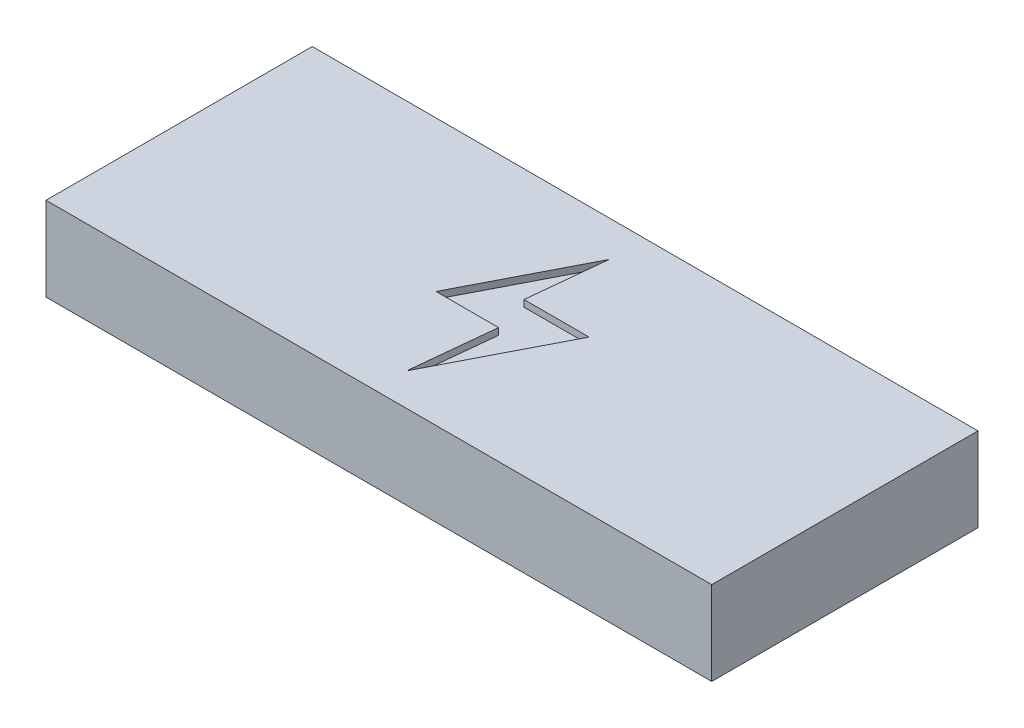
ISO-10303-21;
HEADER;
FILE_DESCRIPTION(('STEP AP214'),'2;1');
FILE_NAME('part.step','',(''),(''),'','','');
FILE_SCHEMA(('AUTOMOTIVE_DESIGN { 1 0 10303 214 1 1 1 1 }'));
ENDSEC;
DATA;
#1=APPLICATION_CONTEXT('core data for automotive mechanical design processes');
#2=APPLICATION_PROTOCOL_DEFINITION('international standard','automotive_design',2000,#1);
#3=PRODUCT_CONTEXT('',#1,'mechanical');
#4=PRODUCT('Part','Part','',(#3));
#5=PRODUCT_RELATED_PRODUCT_CATEGORY('part','',(#4));
#6=PRODUCT_DEFINITION_FORMATION('','',#4);
#7=PRODUCT_DEFINITION_CONTEXT('part definition',#1,'design');
#8=PRODUCT_DEFINITION('design','',#6,#7);
#9=PRODUCT_DEFINITION_SHAPE('','',#8);
#10=(LENGTH_UNIT() NAMED_UNIT(*) SI_UNIT(.MILLI.,.METRE.));
#11=(NAMED_UNIT(*) PLANE_ANGLE_UNIT() SI_UNIT($,.RADIAN.));
#12=(NAMED_UNIT(*) SI_UNIT($,.STERADIAN.) SOLID_ANGLE_UNIT());
#13=UNCERTAINTY_MEASURE_WITH_UNIT(LENGTH_MEASURE(1.E-05),#10,'distance_accuracy_value','');
#14=(GEOMETRIC_REPRESENTATION_CONTEXT(3) GLOBAL_UNCERTAINTY_ASSIGNED_CONTEXT((#13)) GLOBAL_UNIT_ASSIGNED_CONTEXT((#10,
#11,#12)) REPRESENTATION_CONTEXT('',''));
#15=CARTESIAN_POINT('',(0.,0.,0.));
#16=DIRECTION('',(0.,0.,1.));
#17=DIRECTION('',(1.,0.,0.));
#18=AXIS2_PLACEMENT_3D('',#15,#16,#17);
#19=CARTESIAN_POINT('',(25.,6.3,10.));
#20=DIRECTION('',(-1.,0.,0.));
#21=DIRECTION('',(0.,0.,1.));
#22=AXIS2_PLACEMENT_3D('',#19,#20,#21);
#23=PLANE('',#22);
#24=DIRECTION('',(0.,0.,-1.));
#25=VECTOR('',#24,1.);
#26=CARTESIAN_POINT('',(25.,0.,10.));
#27=LINE('',#26,#25);
#28=CARTESIAN_POINT('',(25.,0.,10.));
#29=VERTEX_POINT('',#28);
#30=CARTESIAN_POINT('',(25.,0.,-10.));
#31=VERTEX_POINT('',#30);
#32=EDGE_CURVE('E186',#29,#31,#27,.T.);
#33=ORIENTED_EDGE('',*,*,#32,.T.);
#34=DIRECTION('',(0.,-1.,0.));
#35=VECTOR('',#34,1.);
#36=CARTESIAN_POINT('',(25.,6.3,-10.));
#37=LINE('',#36,#35);
#38=CARTESIAN_POINT('',(25.,6.3,-10.));
#39=VERTEX_POINT('',#38);
#40=EDGE_CURVE('E11',#39,#31,#37,.T.);
#41=ORIENTED_EDGE('',*,*,#40,.F.);
#42=DIRECTION('',(0.,0.,-1.));
#43=VECTOR('',#42,1.);
#44=CARTESIAN_POINT('',(25.,6.3,10.));
#45=LINE('',#44,#43);
#46=CARTESIAN_POINT('',(25.,6.3,10.));
#47=VERTEX_POINT('',#46);
#48=EDGE_CURVE('E198',#47,#39,#45,.T.);
#49=ORIENTED_EDGE('',*,*,#48,.F.);
#50=DIRECTION('',(0.,-1.,0.));
#51=VECTOR('',#50,1.);
#52=CARTESIAN_POINT('',(25.,6.3,10.));
#53=LINE('',#52,#51);
#54=EDGE_CURVE('E208',#47,#29,#53,.T.);
#55=ORIENTED_EDGE('',*,*,#54,.T.);
#56=EDGE_LOOP('',(#33,#41,#49,#55));
#57=FACE_BOUND('',#56,.T.);
#58=ADVANCED_FACE('F39',(#57),#23,.F.);
#59=CARTESIAN_POINT('',(-25.,6.3,-10.));
#60=DIRECTION('',(0.,0.,1.));
#61=DIRECTION('',(1.,0.,0.));
#62=AXIS2_PLACEMENT_3D('',#59,#60,#61);
#63=PLANE('',#62);
#64=DIRECTION('',(-1.,0.,0.));
#65=VECTOR('',#64,1.);
#66=CARTESIAN_POINT('',(-25.,0.,-10.));
#67=LINE('',#66,#65);
#68=CARTESIAN_POINT('',(-25.,0.,-10.));
#69=VERTEX_POINT('',#68);
#70=EDGE_CURVE('E212',#31,#69,#67,.T.);
#71=ORIENTED_EDGE('',*,*,#70,.T.);
#72=DIRECTION('',(0.,-1.,0.));
#73=VECTOR('',#72,1.);
#74=CARTESIAN_POINT('',(-25.,6.3,-10.));
#75=LINE('',#74,#73);
#76=CARTESIAN_POINT('',(-25.,6.3,-10.));
#77=VERTEX_POINT('',#76);
#78=EDGE_CURVE('E47',#77,#69,#75,.T.);
#79=ORIENTED_EDGE('',*,*,#78,.F.);
#80=DIRECTION('',(-1.,0.,0.));
#81=VECTOR('',#80,1.);
#82=CARTESIAN_POINT('',(-25.,6.3,-10.));
#83=LINE('',#82,#81);
#84=EDGE_CURVE('E91',#39,#77,#83,.T.);
#85=ORIENTED_EDGE('',*,*,#84,.F.);
#86=ORIENTED_EDGE('',*,*,#40,.T.);
#87=EDGE_LOOP('',(#71,#79,#85,#86));
#88=FACE_BOUND('',#87,.T.);
#89=ADVANCED_FACE('F247',(#88),#63,.F.);
#90=CARTESIAN_POINT('',(-25.,6.3,10.));
#91=DIRECTION('',(1.,0.,0.));
#92=DIRECTION('',(0.,0.,-1.));
#93=AXIS2_PLACEMENT_3D('',#90,#91,#92);
#94=PLANE('',#93);
#95=DIRECTION('',(0.,0.,1.));
#96=VECTOR('',#95,1.);
#97=CARTESIAN_POINT('',(-25.,0.,10.));
#98=LINE('',#97,#96);
#99=CARTESIAN_POINT('',(-25.,0.,10.));
#100=VERTEX_POINT('',#99);
#101=EDGE_CURVE('E215',#69,#100,#98,.T.);
#102=ORIENTED_EDGE('',*,*,#101,.T.);
#103=DIRECTION('',(0.,-1.,0.));
#104=VECTOR('',#103,1.);
#105=CARTESIAN_POINT('',(-25.,6.3,10.));
#106=LINE('',#105,#104);
#107=CARTESIAN_POINT('',(-25.,6.3,10.));
#108=VERTEX_POINT('',#107);
#109=EDGE_CURVE('E222',#108,#100,#106,.T.);
#110=ORIENTED_EDGE('',*,*,#109,.F.);
#111=DIRECTION('',(0.,0.,1.));
#112=VECTOR('',#111,1.);
#113=CARTESIAN_POINT('',(-25.,6.3,10.));
#114=LINE('',#113,#112);
#115=EDGE_CURVE('E203',#77,#108,#114,.T.);
#116=ORIENTED_EDGE('',*,*,#115,.F.);
#117=ORIENTED_EDGE('',*,*,#78,.T.);
#118=EDGE_LOOP('',(#102,#110,#116,#117));
#119=FACE_BOUND('',#118,.T.);
#120=ADVANCED_FACE('F229',(#119),#94,.F.);
#121=CARTESIAN_POINT('',(-25.,6.3,10.));
#122=DIRECTION('',(0.,0.,-1.));
#123=DIRECTION('',(-1.,0.,0.));
#124=AXIS2_PLACEMENT_3D('',#121,#122,#123);
#125=PLANE('',#124);
#126=DIRECTION('',(1.,0.,0.));
#127=VECTOR('',#126,1.);
#128=CARTESIAN_POINT('',(-25.,0.,10.));
#129=LINE('',#128,#127);
#130=EDGE_CURVE('E84',#100,#29,#129,.T.);
#131=ORIENTED_EDGE('',*,*,#130,.T.);
#132=ORIENTED_EDGE('',*,*,#54,.F.);
#133=DIRECTION('',(1.,0.,0.));
#134=VECTOR('',#133,1.);
#135=CARTESIAN_POINT('',(-25.,6.3,10.));
#136=LINE('',#135,#134);
#137=EDGE_CURVE('E63',#108,#47,#136,.T.);
#138=ORIENTED_EDGE('',*,*,#137,.F.);
#139=ORIENTED_EDGE('',*,*,#109,.T.);
#140=EDGE_LOOP('',(#131,#132,#138,#139));
#141=FACE_BOUND('',#140,.T.);
#142=ADVANCED_FACE('F237',(#141),#125,.F.);
#143=CARTESIAN_POINT('',(0.,6.3,0.));
#144=DIRECTION('',(0.,-1.,0.));
#145=DIRECTION('',(0.,0.,-1.));
#146=AXIS2_PLACEMENT_3D('',#143,#144,#145);
#147=PLANE('',#146);
#148=DIRECTION('',(-0.457527816229281,0.,0.889195308903767));
#149=VECTOR('',#148,1.);
#150=CARTESIAN_POINT('',(0.,6.3,-7.30603102438465));
#151=LINE('',#150,#149);
#152=CARTESIAN_POINT('',(0.,6.3,-7.30603102438465));
#153=VERTEX_POINT('',#152);
#154=CARTESIAN_POINT('',(-4.42027104045906,6.3,1.28466911195346));
#155=VERTEX_POINT('',#154);
#156=EDGE_CURVE('E169',#153,#155,#151,.T.);
#157=ORIENTED_EDGE('',*,*,#156,.F.);
#158=DIRECTION('',(0.101662662048414,0.,-0.994818929828554));
#159=VECTOR('',#158,1.);
#160=CARTESIAN_POINT('',(-0.593652908235739,6.3,-1.49684662018872));
#161=LINE('',#160,#159);
#162=CARTESIAN_POINT('',(-0.593652908235739,6.3,-1.49684662018872));
#163=VERTEX_POINT('',#162);
#164=EDGE_CURVE('E54',#163,#153,#161,.T.);
#165=ORIENTED_EDGE('',*,*,#164,.F.);
#166=DIRECTION('',(-1.,0.,0.));
#167=VECTOR('',#166,1.);
#168=CARTESIAN_POINT('',(4.29302244300048,6.3,-1.49684662018872));
#169=LINE('',#168,#167);
#170=CARTESIAN_POINT('',(4.29302244300048,6.3,-1.49684662018872));
#171=VERTEX_POINT('',#170);
#172=EDGE_CURVE('E149',#171,#163,#169,.T.);
#173=ORIENTED_EDGE('',*,*,#172,.F.);
#174=DIRECTION('',(0.457527816229281,0.,-0.889195308903767));
#175=VECTOR('',#174,1.);
#176=CARTESIAN_POINT('',(-0.362091910560025,6.3,7.5502663612923));
#177=LINE('',#176,#175);
#178=CARTESIAN_POINT('',(-0.362091910560025,6.3,7.5502663612923));
#179=VERTEX_POINT('',#178);
#180=EDGE_CURVE('E153',#179,#171,#177,.T.);
#181=ORIENTED_EDGE('',*,*,#180,.F.);
#182=DIRECTION('',(-0.101662662048414,0.,0.994818929828554));
#183=VECTOR('',#182,1.);
#184=CARTESIAN_POINT('',(0.278202796940949,6.3,1.28466911195346));
#185=LINE('',#184,#183);
#186=CARTESIAN_POINT('',(0.278202796940949,6.3,1.28466911195346));
#187=VERTEX_POINT('',#186);
#188=EDGE_CURVE('E176',#187,#179,#185,.T.);
#189=ORIENTED_EDGE('',*,*,#188,.F.);
#190=DIRECTION('',(1.,0.,0.));
#191=VECTOR('',#190,1.);
#192=CARTESIAN_POINT('',(-4.42027104045906,6.3,1.28466911195346));
#193=LINE('',#192,#191);
#194=EDGE_CURVE('E172',#155,#187,#193,.T.);
#195=ORIENTED_EDGE('',*,*,#194,.F.);
#196=EDGE_LOOP('',(#157,#165,#173,#181,#189,#195));
#197=FACE_BOUND('',#196,.T.);
#198=ORIENTED_EDGE('',*,*,#48,.T.);
#199=ORIENTED_EDGE('',*,*,#84,.T.);
#200=ORIENTED_EDGE('',*,*,#115,.T.);
#201=ORIENTED_EDGE('',*,*,#137,.T.);
#202=EDGE_LOOP('',(#198,#199,#200,#201));
#203=FACE_BOUND('',#202,.T.);
#204=ADVANCED_FACE('F239',(#197,#203),#147,.F.);
#205=CARTESIAN_POINT('',(0.,0.,0.));
#206=DIRECTION('',(0.,-1.,0.));
#207=DIRECTION('',(0.,0.,-1.));
#208=AXIS2_PLACEMENT_3D('',#205,#206,#207);
#209=PLANE('',#208);
#210=ORIENTED_EDGE('',*,*,#32,.F.);
#211=ORIENTED_EDGE('',*,*,#130,.F.);
#212=ORIENTED_EDGE('',*,*,#101,.F.);
#213=ORIENTED_EDGE('',*,*,#70,.F.);
#214=EDGE_LOOP('',(#210,#211,#212,#213));
#215=FACE_BOUND('',#214,.T.);
#216=ADVANCED_FACE('F233',(#215),#209,.T.);
#217=CARTESIAN_POINT('',(-0.593652908235739,5.8,-1.49684662018872));
#218=DIRECTION('',(0.994818929828554,0.,0.101662662048414));
#219=DIRECTION('',(0.101662662048414,0.,-0.994818929828554));
#220=AXIS2_PLACEMENT_3D('',#217,#218,#219);
#221=PLANE('',#220);
#222=ORIENTED_EDGE('',*,*,#164,.T.);
#223=DIRECTION('',(0.,1.,0.));
#224=VECTOR('',#223,1.);
#225=CARTESIAN_POINT('',(0.,5.8,-7.30603102438465));
#226=LINE('',#225,#224);
#227=CARTESIAN_POINT('',(0.,5.8,-7.30603102438465));
#228=VERTEX_POINT('',#227);
#229=EDGE_CURVE('E123',#228,#153,#226,.T.);
#230=ORIENTED_EDGE('',*,*,#229,.F.);
#231=DIRECTION('',(0.101662662048414,0.,-0.994818929828554));
#232=VECTOR('',#231,1.);
#233=CARTESIAN_POINT('',(-0.593652908235739,5.8,-1.49684662018872));
#234=LINE('',#233,#232);
#235=CARTESIAN_POINT('',(-0.593652908235739,5.8,-1.49684662018872));
#236=VERTEX_POINT('',#235);
#237=EDGE_CURVE('E127',#236,#228,#234,.T.);
#238=ORIENTED_EDGE('',*,*,#237,.F.);
#239=DIRECTION('',(0.,1.,0.));
#240=VECTOR('',#239,1.);
#241=CARTESIAN_POINT('',(-0.593652908235739,5.8,-1.49684662018872));
#242=LINE('',#241,#240);
#243=EDGE_CURVE('E183',#236,#163,#242,.T.);
#244=ORIENTED_EDGE('',*,*,#243,.T.);
#245=EDGE_LOOP('',(#222,#230,#238,#244));
#246=FACE_BOUND('',#245,.T.);
#247=ADVANCED_FACE('F125',(#246),#221,.F.);
#248=CARTESIAN_POINT('',(4.29302244300048,5.8,-1.49684662018872));
#249=DIRECTION('',(0.,0.,-1.));
#250=DIRECTION('',(-1.,0.,0.));
#251=AXIS2_PLACEMENT_3D('',#248,#249,#250);
#252=PLANE('',#251);
#253=ORIENTED_EDGE('',*,*,#172,.T.);
#254=ORIENTED_EDGE('',*,*,#243,.F.);
#255=DIRECTION('',(-1.,0.,0.));
#256=VECTOR('',#255,1.);
#257=CARTESIAN_POINT('',(4.29302244300048,5.8,-1.49684662018872));
#258=LINE('',#257,#256);
#259=CARTESIAN_POINT('',(4.29302244300048,5.8,-1.49684662018872));
#260=VERTEX_POINT('',#259);
#261=EDGE_CURVE('E134',#260,#236,#258,.T.);
#262=ORIENTED_EDGE('',*,*,#261,.F.);
#263=DIRECTION('',(0.,1.,0.));
#264=VECTOR('',#263,1.);
#265=CARTESIAN_POINT('',(4.29302244300048,5.8,-1.49684662018872));
#266=LINE('',#265,#264);
#267=EDGE_CURVE('E187',#260,#171,#266,.T.);
#268=ORIENTED_EDGE('',*,*,#267,.T.);
#269=EDGE_LOOP('',(#253,#254,#262,#268));
#270=FACE_BOUND('',#269,.T.);
#271=ADVANCED_FACE('F286',(#270),#252,.F.);
#272=CARTESIAN_POINT('',(-0.362091910560025,5.8,7.5502663612923));
#273=DIRECTION('',(0.889195308903767,0.,0.457527816229281));
#274=DIRECTION('',(0.457527816229281,0.,-0.889195308903767));
#275=AXIS2_PLACEMENT_3D('',#272,#273,#274);
#276=PLANE('',#275);
#277=ORIENTED_EDGE('',*,*,#180,.T.);
#278=ORIENTED_EDGE('',*,*,#267,.F.);
#279=DIRECTION('',(0.457527816229281,0.,-0.889195308903767));
#280=VECTOR('',#279,1.);
#281=CARTESIAN_POINT('',(-0.362091910560025,5.8,7.5502663612923));
#282=LINE('',#281,#280);
#283=CARTESIAN_POINT('',(-0.362091910560025,5.8,7.5502663612923));
#284=VERTEX_POINT('',#283);
#285=EDGE_CURVE('E162',#284,#260,#282,.T.);
#286=ORIENTED_EDGE('',*,*,#285,.F.);
#287=DIRECTION('',(0.,1.,0.));
#288=VECTOR('',#287,1.);
#289=CARTESIAN_POINT('',(-0.362091910560025,5.8,7.5502663612923));
#290=LINE('',#289,#288);
#291=EDGE_CURVE('E190',#284,#179,#290,.T.);
#292=ORIENTED_EDGE('',*,*,#291,.T.);
#293=EDGE_LOOP('',(#277,#278,#286,#292));
#294=FACE_BOUND('',#293,.T.);
#295=ADVANCED_FACE('F295',(#294),#276,.F.);
#296=CARTESIAN_POINT('',(0.278202796940949,5.8,1.28466911195346));
#297=DIRECTION('',(-0.994818929828554,0.,-0.101662662048414));
#298=DIRECTION('',(-0.101662662048414,0.,0.994818929828554));
#299=AXIS2_PLACEMENT_3D('',#296,#297,#298);
#300=PLANE('',#299);
#301=ORIENTED_EDGE('',*,*,#188,.T.);
#302=ORIENTED_EDGE('',*,*,#291,.F.);
#303=DIRECTION('',(-0.101662662048414,0.,0.994818929828554));
#304=VECTOR('',#303,1.);
#305=CARTESIAN_POINT('',(0.278202796940949,5.8,1.28466911195346));
#306=LINE('',#305,#304);
#307=CARTESIAN_POINT('',(0.278202796940949,5.8,1.28466911195346));
#308=VERTEX_POINT('',#307);
#309=EDGE_CURVE('E158',#308,#284,#306,.T.);
#310=ORIENTED_EDGE('',*,*,#309,.F.);
#311=DIRECTION('',(0.,1.,0.));
#312=VECTOR('',#311,1.);
#313=CARTESIAN_POINT('',(0.278202796940949,5.8,1.28466911195346));
#314=LINE('',#313,#312);
#315=EDGE_CURVE('E193',#308,#187,#314,.T.);
#316=ORIENTED_EDGE('',*,*,#315,.T.);
#317=EDGE_LOOP('',(#301,#302,#310,#316));
#318=FACE_BOUND('',#317,.T.);
#319=ADVANCED_FACE('F305',(#318),#300,.F.);
#320=CARTESIAN_POINT('',(-4.42027104045906,5.8,1.28466911195346));
#321=DIRECTION('',(0.,0.,1.));
#322=DIRECTION('',(1.,0.,0.));
#323=AXIS2_PLACEMENT_3D('',#320,#321,#322);
#324=PLANE('',#323);
#325=ORIENTED_EDGE('',*,*,#194,.T.);
#326=ORIENTED_EDGE('',*,*,#315,.F.);
#327=DIRECTION('',(1.,0.,0.));
#328=VECTOR('',#327,1.);
#329=CARTESIAN_POINT('',(-4.42027104045906,5.8,1.28466911195346));
#330=LINE('',#329,#328);
#331=CARTESIAN_POINT('',(-4.42027104045906,5.8,1.28466911195346));
#332=VERTEX_POINT('',#331);
#333=EDGE_CURVE('E143',#332,#308,#330,.T.);
#334=ORIENTED_EDGE('',*,*,#333,.F.);
#335=DIRECTION('',(0.,1.,0.));
#336=VECTOR('',#335,1.);
#337=CARTESIAN_POINT('',(-4.42027104045906,5.8,1.28466911195346));
#338=LINE('',#337,#336);
#339=EDGE_CURVE('E133',#332,#155,#338,.T.);
#340=ORIENTED_EDGE('',*,*,#339,.T.);
#341=EDGE_LOOP('',(#325,#326,#334,#340));
#342=FACE_BOUND('',#341,.T.);
#343=ADVANCED_FACE('F315',(#342),#324,.F.);
#344=CARTESIAN_POINT('',(0.,5.8,-7.30603102438465));
#345=DIRECTION('',(-0.889195308903767,0.,-0.457527816229281));
#346=DIRECTION('',(-0.457527816229281,0.,0.889195308903767));
#347=AXIS2_PLACEMENT_3D('',#344,#345,#346);
#348=PLANE('',#347);
#349=ORIENTED_EDGE('',*,*,#156,.T.);
#350=ORIENTED_EDGE('',*,*,#339,.F.);
#351=DIRECTION('',(-0.457527816229281,0.,0.889195308903767));
#352=VECTOR('',#351,1.);
#353=CARTESIAN_POINT('',(0.,5.8,-7.30603102438465));
#354=LINE('',#353,#352);
#355=EDGE_CURVE('E137',#228,#332,#354,.T.);
#356=ORIENTED_EDGE('',*,*,#355,.F.);
#357=ORIENTED_EDGE('',*,*,#229,.T.);
#358=EDGE_LOOP('',(#349,#350,#356,#357));
#359=FACE_BOUND('',#358,.T.);
#360=ADVANCED_FACE('F138',(#359),#348,.F.);
#361=CARTESIAN_POINT('',(0.,5.8,0.));
#362=DIRECTION('',(0.,-1.,0.));
#363=DIRECTION('',(0.,0.,-1.));
#364=AXIS2_PLACEMENT_3D('',#361,#362,#363);
#365=PLANE('',#364);
#366=ORIENTED_EDGE('',*,*,#237,.T.);
#367=ORIENTED_EDGE('',*,*,#355,.T.);
#368=ORIENTED_EDGE('',*,*,#333,.T.);
#369=ORIENTED_EDGE('',*,*,#309,.T.);
#370=ORIENTED_EDGE('',*,*,#285,.T.);
#371=ORIENTED_EDGE('',*,*,#261,.T.);
#372=EDGE_LOOP('',(#366,#367,#368,#369,#370,#371));
#373=FACE_BOUND('',#372,.T.);
#374=ADVANCED_FACE('F145',(#373),#365,.F.);
#375=CLOSED_SHELL('',(#58,#89,#120,#142,#204,#216,#247,#271,#295,#319,#343,#360,#374));
#376=MANIFOLD_SOLID_BREP('B2',#375);
#377=ADVANCED_BREP_SHAPE_REPRESENTATION('',(#18,#376),#14);
#378=SHAPE_DEFINITION_REPRESENTATION(#9,#377);
ENDSEC;
END-ISO-10303-21;
